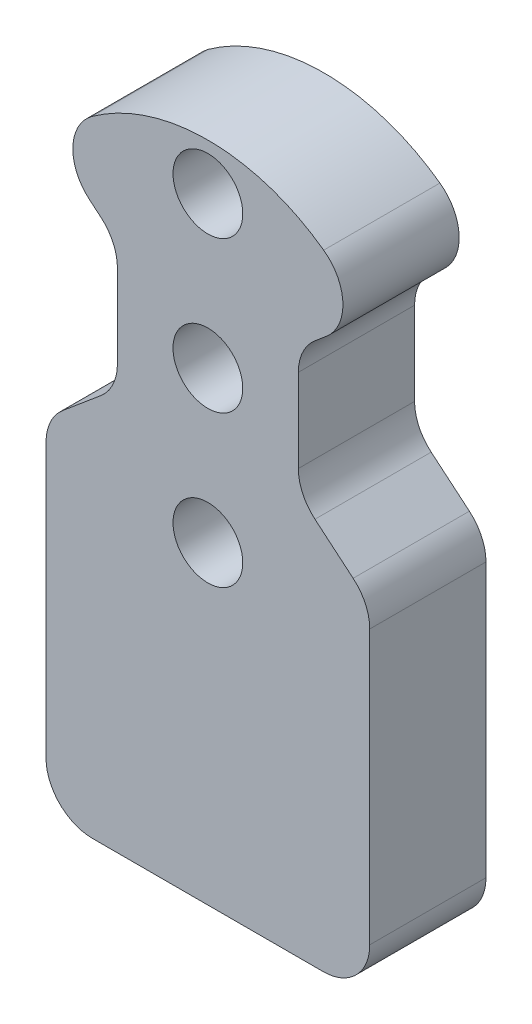
ISO-10303-21;
HEADER;
FILE_DESCRIPTION(('STEP AP214'),'2;1');
FILE_NAME('part.step','',(''),(''),'','','');
FILE_SCHEMA(('AUTOMOTIVE_DESIGN { 1 0 10303 214 1 1 1 1 }'));
ENDSEC;
DATA;
#1=APPLICATION_CONTEXT('core data for automotive mechanical design processes');
#2=APPLICATION_PROTOCOL_DEFINITION('international standard','automotive_design',2000,#1);
#3=PRODUCT_CONTEXT('',#1,'mechanical');
#4=PRODUCT('Part','Part','',(#3));
#5=PRODUCT_RELATED_PRODUCT_CATEGORY('part','',(#4));
#6=PRODUCT_DEFINITION_FORMATION('','',#4);
#7=PRODUCT_DEFINITION_CONTEXT('part definition',#1,'design');
#8=PRODUCT_DEFINITION('design','',#6,#7);
#9=PRODUCT_DEFINITION_SHAPE('','',#8);
#10=(LENGTH_UNIT() NAMED_UNIT(*) SI_UNIT(.MILLI.,.METRE.));
#11=(NAMED_UNIT(*) PLANE_ANGLE_UNIT() SI_UNIT($,.RADIAN.));
#12=(NAMED_UNIT(*) SI_UNIT($,.STERADIAN.) SOLID_ANGLE_UNIT());
#13=UNCERTAINTY_MEASURE_WITH_UNIT(LENGTH_MEASURE(1.E-05),#10,'distance_accuracy_value','');
#14=(GEOMETRIC_REPRESENTATION_CONTEXT(3) GLOBAL_UNCERTAINTY_ASSIGNED_CONTEXT((#13)) GLOBAL_UNIT_ASSIGNED_CONTEXT((#10,
#11,#12)) REPRESENTATION_CONTEXT('',''));
#15=CARTESIAN_POINT('',(0.,0.,0.));
#16=DIRECTION('',(0.,0.,1.));
#17=DIRECTION('',(1.,0.,0.));
#18=AXIS2_PLACEMENT_3D('',#15,#16,#17);
#19=CARTESIAN_POINT('',(0.,0.,5.));
#20=DIRECTION('',(0.,0.,1.));
#21=DIRECTION('',(1.,0.,0.));
#22=AXIS2_PLACEMENT_3D('',#19,#20,#21);
#23=PLANE('',#22);
#24=CARTESIAN_POINT('',(0.,0.,5.));
#25=DIRECTION('',(0.,0.,-1.));
#26=DIRECTION('',(-1.,0.,0.));
#27=AXIS2_PLACEMENT_3D('',#24,#25,#26);
#28=CIRCLE('',#27,1.5);
#29=CARTESIAN_POINT('',(-1.5,0.,5.));
#30=VERTEX_POINT('',#29);
#31=EDGE_CURVE('E266',#30,#30,#28,.T.);
#32=ORIENTED_EDGE('',*,*,#31,.T.);
#33=EDGE_LOOP('',(#32));
#34=FACE_BOUND('',#33,.T.);
#35=CARTESIAN_POINT('',(0.,6.5,5.));
#36=DIRECTION('',(0.,0.,1.));
#37=DIRECTION('',(1.,0.,0.));
#38=AXIS2_PLACEMENT_3D('',#35,#36,#37);
#39=CIRCLE('',#38,1.5);
#40=CARTESIAN_POINT('',(1.5,6.5,5.));
#41=VERTEX_POINT('',#40);
#42=EDGE_CURVE('E291',#41,#41,#39,.T.);
#43=ORIENTED_EDGE('',*,*,#42,.F.);
#44=EDGE_LOOP('',(#43));
#45=FACE_BOUND('',#44,.T.);
#46=CARTESIAN_POINT('',(0.,-6.5,5.));
#47=DIRECTION('',(0.,0.,1.));
#48=DIRECTION('',(1.,0.,0.));
#49=AXIS2_PLACEMENT_3D('',#46,#47,#48);
#50=CIRCLE('',#49,1.5);
#51=CARTESIAN_POINT('',(1.5,-6.5,5.));
#52=VERTEX_POINT('',#51);
#53=EDGE_CURVE('E279',#52,#52,#50,.T.);
#54=ORIENTED_EDGE('',*,*,#53,.F.);
#55=EDGE_LOOP('',(#54));
#56=FACE_BOUND('',#55,.T.);
#57=DIRECTION('',(0.,-1.,0.));
#58=VECTOR('',#57,1.);
#59=CARTESIAN_POINT('',(6.96279237645642,0.,5.));
#60=LINE('',#59,#58);
#61=CARTESIAN_POINT('',(6.96279237645642,-6.23466655738126,5.));
#62=VERTEX_POINT('',#61);
#63=CARTESIAN_POINT('',(6.96279237645642,-18.,5.));
#64=VERTEX_POINT('',#63);
#65=EDGE_CURVE('E273',#62,#64,#60,.T.);
#66=ORIENTED_EDGE('',*,*,#65,.F.);
#67=CARTESIAN_POINT('',(4.96279237645642,-6.23466655738126,5.));
#68=DIRECTION('',(0.,0.,1.));
#69=DIRECTION('',(1.,0.,0.));
#70=AXIS2_PLACEMENT_3D('',#67,#68,#69);
#71=CIRCLE('',#70,2.);
#72=CARTESIAN_POINT('',(6.2483675958295,-4.7025776711433,5.));
#73=VERTEX_POINT('',#72);
#74=EDGE_CURVE('E338',#62,#73,#71,.T.);
#75=ORIENTED_EDGE('',*,*,#74,.T.);
#76=DIRECTION('',(0.766044443118977,-0.642787609686541,0.));
#77=VECTOR('',#76,1.);
#78=CARTESIAN_POINT('',(0.266107499868307,0.317134568984317,5.));
#79=LINE('',#78,#77);
#80=CARTESIAN_POINT('',(4.60539699099962,-3.32396164259543,5.));
#81=VERTEX_POINT('',#80);
#82=EDGE_CURVE('E241',#81,#73,#79,.T.);
#83=ORIENTED_EDGE('',*,*,#82,.F.);
#84=CARTESIAN_POINT('',(5.89097221037271,-1.79187275635748,5.));
#85=DIRECTION('',(0.,0.,1.));
#86=DIRECTION('',(1.,0.,0.));
#87=AXIS2_PLACEMENT_3D('',#84,#85,#86);
#88=CIRCLE('',#87,2.);
#89=CARTESIAN_POINT('',(3.89097221037271,-1.79187275635748,5.));
#90=VERTEX_POINT('',#89);
#91=EDGE_CURVE('E371',#81,#90,#88,.F.);
#92=ORIENTED_EDGE('',*,*,#91,.T.);
#93=DIRECTION('',(0.,-1.,0.));
#94=VECTOR('',#93,1.);
#95=CARTESIAN_POINT('',(3.89097221037271,0.,5.));
#96=LINE('',#95,#94);
#97=CARTESIAN_POINT('',(3.89097221037271,1.79187275635747,5.));
#98=VERTEX_POINT('',#97);
#99=EDGE_CURVE('E254',#98,#90,#96,.T.);
#100=ORIENTED_EDGE('',*,*,#99,.F.);
#101=CARTESIAN_POINT('',(5.89097221037271,1.79187275635747,5.));
#102=DIRECTION('',(0.,0.,1.));
#103=DIRECTION('',(1.,0.,0.));
#104=AXIS2_PLACEMENT_3D('',#101,#102,#103);
#105=CIRCLE('',#104,2.);
#106=CARTESIAN_POINT('',(4.60539699099964,3.32396164259543,5.));
#107=VERTEX_POINT('',#106);
#108=EDGE_CURVE('E218',#98,#107,#105,.F.);
#109=ORIENTED_EDGE('',*,*,#108,.T.);
#110=DIRECTION('',(0.766044443118982,0.642787609686535,0.));
#111=VECTOR('',#110,1.);
#112=CARTESIAN_POINT('',(0.266107499868282,-0.317134568984292,5.));
#113=LINE('',#112,#111);
#114=CARTESIAN_POINT('',(5.09489655719941,3.73470054805509,5.));
#115=VERTEX_POINT('',#114);
#116=EDGE_CURVE('E228',#107,#115,#113,.T.);
#117=ORIENTED_EDGE('',*,*,#116,.T.);
#118=CARTESIAN_POINT('',(3.80932133782634,5.26678943429306,5.));
#119=DIRECTION('',(0.,0.,1.));
#120=DIRECTION('',(1.,0.,0.));
#121=AXIS2_PLACEMENT_3D('',#118,#119,#120);
#122=CIRCLE('',#121,2.);
#123=CARTESIAN_POINT('',(4.98142021100367,6.88734002946015,5.));
#124=VERTEX_POINT('',#123);
#125=EDGE_CURVE('E329',#115,#124,#122,.T.);
#126=ORIENTED_EDGE('',*,*,#125,.T.);
#127=CARTESIAN_POINT('',(0.,0.,5.));
#128=DIRECTION('',(0.,0.,1.));
#129=DIRECTION('',(1.,0.,0.));
#130=AXIS2_PLACEMENT_3D('',#127,#128,#129);
#131=CIRCLE('',#130,8.5);
#132=CARTESIAN_POINT('',(-4.98142021100366,6.88734002946016,5.));
#133=VERTEX_POINT('',#132);
#134=EDGE_CURVE('E299',#124,#133,#131,.T.);
#135=ORIENTED_EDGE('',*,*,#134,.T.);
#136=CARTESIAN_POINT('',(-3.80932133782633,5.26678943429306,5.));
#137=DIRECTION('',(0.,0.,1.));
#138=DIRECTION('',(1.,0.,0.));
#139=AXIS2_PLACEMENT_3D('',#136,#137,#138);
#140=CIRCLE('',#139,2.);
#141=CARTESIAN_POINT('',(-5.09489655719941,3.73470054805511,5.));
#142=VERTEX_POINT('',#141);
#143=EDGE_CURVE('E331',#133,#142,#140,.T.);
#144=ORIENTED_EDGE('',*,*,#143,.T.);
#145=DIRECTION('',(-0.766044443118977,0.642787609686541,0.));
#146=VECTOR('',#145,1.);
#147=CARTESIAN_POINT('',(-0.266107499868308,-0.317134568984318,5.));
#148=LINE('',#147,#146);
#149=CARTESIAN_POINT('',(-4.60539699099963,3.32396164259543,5.));
#150=VERTEX_POINT('',#149);
#151=EDGE_CURVE('E253',#150,#142,#148,.T.);
#152=ORIENTED_EDGE('',*,*,#151,.F.);
#153=CARTESIAN_POINT('',(-5.89097221037271,1.79187275635748,5.));
#154=DIRECTION('',(0.,0.,1.));
#155=DIRECTION('',(1.,0.,0.));
#156=AXIS2_PLACEMENT_3D('',#153,#154,#155);
#157=CIRCLE('',#156,2.);
#158=CARTESIAN_POINT('',(-3.89097221037271,1.79187275635748,5.));
#159=VERTEX_POINT('',#158);
#160=EDGE_CURVE('E12',#150,#159,#157,.F.);
#161=ORIENTED_EDGE('',*,*,#160,.T.);
#162=DIRECTION('',(0.,1.,0.));
#163=VECTOR('',#162,1.);
#164=CARTESIAN_POINT('',(-3.89097221037271,0.,5.));
#165=LINE('',#164,#163);
#166=CARTESIAN_POINT('',(-3.89097221037271,-1.79187275635747,5.));
#167=VERTEX_POINT('',#166);
#168=EDGE_CURVE('E260',#167,#159,#165,.T.);
#169=ORIENTED_EDGE('',*,*,#168,.F.);
#170=CARTESIAN_POINT('',(-5.89097221037271,-1.79187275635747,5.));
#171=DIRECTION('',(0.,0.,1.));
#172=DIRECTION('',(1.,0.,0.));
#173=AXIS2_PLACEMENT_3D('',#170,#171,#172);
#174=CIRCLE('',#173,2.);
#175=CARTESIAN_POINT('',(-4.60539699099964,-3.32396164259544,5.));
#176=VERTEX_POINT('',#175);
#177=EDGE_CURVE('E375',#167,#176,#174,.F.);
#178=ORIENTED_EDGE('',*,*,#177,.T.);
#179=DIRECTION('',(-0.766044443118982,-0.642787609686535,0.));
#180=VECTOR('',#179,1.);
#181=CARTESIAN_POINT('',(-0.266107499868282,0.317134568984292,5.));
#182=LINE('',#181,#180);
#183=CARTESIAN_POINT('',(-6.24836759582949,-4.70257767114326,5.));
#184=VERTEX_POINT('',#183);
#185=EDGE_CURVE('E247',#176,#184,#182,.T.);
#186=ORIENTED_EDGE('',*,*,#185,.T.);
#187=CARTESIAN_POINT('',(-4.96279237645642,-6.23466655738123,5.));
#188=DIRECTION('',(0.,0.,1.));
#189=DIRECTION('',(1.,0.,0.));
#190=AXIS2_PLACEMENT_3D('',#187,#188,#189);
#191=CIRCLE('',#190,2.);
#192=CARTESIAN_POINT('',(-6.96279237645642,-6.23466655738123,5.));
#193=VERTEX_POINT('',#192);
#194=EDGE_CURVE('E333',#184,#193,#191,.T.);
#195=ORIENTED_EDGE('',*,*,#194,.T.);
#196=DIRECTION('',(0.,-1.,0.));
#197=VECTOR('',#196,1.);
#198=CARTESIAN_POINT('',(-6.96279237645642,0.,5.));
#199=LINE('',#198,#197);
#200=CARTESIAN_POINT('',(-6.96279237645642,-18.,5.));
#201=VERTEX_POINT('',#200);
#202=EDGE_CURVE('E271',#193,#201,#199,.T.);
#203=ORIENTED_EDGE('',*,*,#202,.T.);
#204=CARTESIAN_POINT('',(-4.96279237645642,-18.,5.));
#205=DIRECTION('',(0.,0.,1.));
#206=DIRECTION('',(1.,0.,0.));
#207=AXIS2_PLACEMENT_3D('',#204,#205,#206);
#208=CIRCLE('',#207,2.);
#209=CARTESIAN_POINT('',(-4.96279237645642,-20.,5.));
#210=VERTEX_POINT('',#209);
#211=EDGE_CURVE('E85',#201,#210,#208,.T.);
#212=ORIENTED_EDGE('',*,*,#211,.T.);
#213=DIRECTION('',(-1.,0.,0.));
#214=VECTOR('',#213,1.);
#215=CARTESIAN_POINT('',(0.,-20.,5.));
#216=LINE('',#215,#214);
#217=CARTESIAN_POINT('',(4.96279237645642,-20.,5.));
#218=VERTEX_POINT('',#217);
#219=EDGE_CURVE('E277',#218,#210,#216,.T.);
#220=ORIENTED_EDGE('',*,*,#219,.F.);
#221=CARTESIAN_POINT('',(4.96279237645642,-18.,5.));
#222=DIRECTION('',(0.,0.,1.));
#223=DIRECTION('',(1.,0.,0.));
#224=AXIS2_PLACEMENT_3D('',#221,#222,#223);
#225=CIRCLE('',#224,2.);
#226=EDGE_CURVE('E336',#218,#64,#225,.T.);
#227=ORIENTED_EDGE('',*,*,#226,.T.);
#228=EDGE_LOOP('',(#66,#75,#83,#92,#100,#109,#117,#126,#135,#144,#152,#161,#169,#178,#186,#195,
#203,#212,#220,#227));
#229=FACE_BOUND('',#228,.T.);
#230=ADVANCED_FACE('F70',(#34,#45,#56,#229),#23,.T.);
#231=CARTESIAN_POINT('',(0.,0.,0.));
#232=DIRECTION('',(0.,0.,1.));
#233=DIRECTION('',(1.,0.,0.));
#234=AXIS2_PLACEMENT_3D('',#231,#232,#233);
#235=PLANE('',#234);
#236=CARTESIAN_POINT('',(0.,0.,0.));
#237=DIRECTION('',(0.,0.,-1.));
#238=DIRECTION('',(-1.,0.,0.));
#239=AXIS2_PLACEMENT_3D('',#236,#237,#238);
#240=CIRCLE('',#239,1.5);
#241=CARTESIAN_POINT('',(-1.5,0.,0.));
#242=VERTEX_POINT('',#241);
#243=EDGE_CURVE('E244',#242,#242,#240,.T.);
#244=ORIENTED_EDGE('',*,*,#243,.F.);
#245=EDGE_LOOP('',(#244));
#246=FACE_BOUND('',#245,.T.);
#247=CARTESIAN_POINT('',(0.,6.5,0.));
#248=DIRECTION('',(0.,0.,1.));
#249=DIRECTION('',(1.,0.,0.));
#250=AXIS2_PLACEMENT_3D('',#247,#248,#249);
#251=CIRCLE('',#250,1.5);
#252=CARTESIAN_POINT('',(1.5,6.5,0.));
#253=VERTEX_POINT('',#252);
#254=EDGE_CURVE('E287',#253,#253,#251,.T.);
#255=ORIENTED_EDGE('',*,*,#254,.T.);
#256=EDGE_LOOP('',(#255));
#257=FACE_BOUND('',#256,.T.);
#258=CARTESIAN_POINT('',(0.,-6.5,0.));
#259=DIRECTION('',(0.,0.,1.));
#260=DIRECTION('',(1.,0.,0.));
#261=AXIS2_PLACEMENT_3D('',#258,#259,#260);
#262=CIRCLE('',#261,1.5);
#263=CARTESIAN_POINT('',(1.5,-6.5,0.));
#264=VERTEX_POINT('',#263);
#265=EDGE_CURVE('E294',#264,#264,#262,.T.);
#266=ORIENTED_EDGE('',*,*,#265,.T.);
#267=EDGE_LOOP('',(#266));
#268=FACE_BOUND('',#267,.T.);
#269=DIRECTION('',(0.766044443118977,-0.642787609686541,0.));
#270=VECTOR('',#269,1.);
#271=CARTESIAN_POINT('',(0.266107499868307,0.317134568984317,0.));
#272=LINE('',#271,#270);
#273=CARTESIAN_POINT('',(4.60539699099962,-3.32396164259543,0.));
#274=VERTEX_POINT('',#273);
#275=CARTESIAN_POINT('',(6.2483675958295,-4.7025776711433,0.));
#276=VERTEX_POINT('',#275);
#277=EDGE_CURVE('E245',#274,#276,#272,.T.);
#278=ORIENTED_EDGE('',*,*,#277,.T.);
#279=CARTESIAN_POINT('',(4.96279237645642,-6.23466655738126,0.));
#280=DIRECTION('',(0.,0.,1.));
#281=DIRECTION('',(1.,0.,0.));
#282=AXIS2_PLACEMENT_3D('',#279,#280,#281);
#283=CIRCLE('',#282,2.);
#284=CARTESIAN_POINT('',(6.96279237645642,-6.23466655738126,0.));
#285=VERTEX_POINT('',#284);
#286=EDGE_CURVE('E322',#276,#285,#283,.F.);
#287=ORIENTED_EDGE('',*,*,#286,.T.);
#288=DIRECTION('',(0.,-1.,0.));
#289=VECTOR('',#288,1.);
#290=CARTESIAN_POINT('',(6.96279237645642,0.,0.));
#291=LINE('',#290,#289);
#292=CARTESIAN_POINT('',(6.96279237645642,-18.,0.));
#293=VERTEX_POINT('',#292);
#294=EDGE_CURVE('E282',#285,#293,#291,.T.);
#295=ORIENTED_EDGE('',*,*,#294,.T.);
#296=CARTESIAN_POINT('',(4.96279237645642,-18.,0.));
#297=DIRECTION('',(0.,0.,1.));
#298=DIRECTION('',(1.,0.,0.));
#299=AXIS2_PLACEMENT_3D('',#296,#297,#298);
#300=CIRCLE('',#299,2.);
#301=CARTESIAN_POINT('',(4.96279237645642,-20.,0.));
#302=VERTEX_POINT('',#301);
#303=EDGE_CURVE('E320',#293,#302,#300,.F.);
#304=ORIENTED_EDGE('',*,*,#303,.T.);
#305=DIRECTION('',(-1.,0.,0.));
#306=VECTOR('',#305,1.);
#307=CARTESIAN_POINT('',(0.,-20.,0.));
#308=LINE('',#307,#306);
#309=CARTESIAN_POINT('',(-4.96279237645642,-20.,0.));
#310=VERTEX_POINT('',#309);
#311=EDGE_CURVE('E274',#302,#310,#308,.T.);
#312=ORIENTED_EDGE('',*,*,#311,.T.);
#313=CARTESIAN_POINT('',(-4.96279237645642,-18.,0.));
#314=DIRECTION('',(0.,0.,1.));
#315=DIRECTION('',(1.,0.,0.));
#316=AXIS2_PLACEMENT_3D('',#313,#314,#315);
#317=CIRCLE('',#316,2.);
#318=CARTESIAN_POINT('',(-6.96279237645642,-18.,0.));
#319=VERTEX_POINT('',#318);
#320=EDGE_CURVE('E318',#310,#319,#317,.F.);
#321=ORIENTED_EDGE('',*,*,#320,.T.);
#322=DIRECTION('',(0.,-1.,0.));
#323=VECTOR('',#322,1.);
#324=CARTESIAN_POINT('',(-6.96279237645642,0.,0.));
#325=LINE('',#324,#323);
#326=CARTESIAN_POINT('',(-6.96279237645642,-6.23466655738123,0.));
#327=VERTEX_POINT('',#326);
#328=EDGE_CURVE('E257',#327,#319,#325,.T.);
#329=ORIENTED_EDGE('',*,*,#328,.F.);
#330=CARTESIAN_POINT('',(-4.96279237645642,-6.23466655738123,0.));
#331=DIRECTION('',(0.,0.,1.));
#332=DIRECTION('',(1.,0.,0.));
#333=AXIS2_PLACEMENT_3D('',#330,#331,#332);
#334=CIRCLE('',#333,2.);
#335=CARTESIAN_POINT('',(-6.24836759582949,-4.70257767114326,0.));
#336=VERTEX_POINT('',#335);
#337=EDGE_CURVE('E316',#327,#336,#334,.F.);
#338=ORIENTED_EDGE('',*,*,#337,.T.);
#339=DIRECTION('',(-0.766044443118982,-0.642787609686535,0.));
#340=VECTOR('',#339,1.);
#341=CARTESIAN_POINT('',(-0.266107499868282,0.317134568984292,0.));
#342=LINE('',#341,#340);
#343=CARTESIAN_POINT('',(-4.60539699099964,-3.32396164259544,0.));
#344=VERTEX_POINT('',#343);
#345=EDGE_CURVE('E250',#344,#336,#342,.T.);
#346=ORIENTED_EDGE('',*,*,#345,.F.);
#347=CARTESIAN_POINT('',(-5.89097221037271,-1.79187275635747,0.));
#348=DIRECTION('',(0.,0.,1.));
#349=DIRECTION('',(1.,0.,0.));
#350=AXIS2_PLACEMENT_3D('',#347,#348,#349);
#351=CIRCLE('',#350,2.);
#352=CARTESIAN_POINT('',(-3.89097221037271,-1.79187275635747,0.));
#353=VERTEX_POINT('',#352);
#354=EDGE_CURVE('E373',#344,#353,#351,.T.);
#355=ORIENTED_EDGE('',*,*,#354,.T.);
#356=DIRECTION('',(0.,1.,0.));
#357=VECTOR('',#356,1.);
#358=CARTESIAN_POINT('',(-3.89097221037271,0.,0.));
#359=LINE('',#358,#357);
#360=CARTESIAN_POINT('',(-3.89097221037271,1.79187275635748,0.));
#361=VERTEX_POINT('',#360);
#362=EDGE_CURVE('E263',#353,#361,#359,.T.);
#363=ORIENTED_EDGE('',*,*,#362,.T.);
#364=CARTESIAN_POINT('',(-5.89097221037271,1.79187275635748,0.));
#365=DIRECTION('',(0.,0.,1.));
#366=DIRECTION('',(1.,0.,0.));
#367=AXIS2_PLACEMENT_3D('',#364,#365,#366);
#368=CIRCLE('',#367,2.);
#369=CARTESIAN_POINT('',(-4.60539699099963,3.32396164259543,0.));
#370=VERTEX_POINT('',#369);
#371=EDGE_CURVE('E78',#361,#370,#368,.T.);
#372=ORIENTED_EDGE('',*,*,#371,.T.);
#373=DIRECTION('',(-0.766044443118977,0.642787609686541,0.));
#374=VECTOR('',#373,1.);
#375=CARTESIAN_POINT('',(-0.266107499868308,-0.317134568984318,0.));
#376=LINE('',#375,#374);
#377=CARTESIAN_POINT('',(-5.09489655719941,3.73470054805511,0.));
#378=VERTEX_POINT('',#377);
#379=EDGE_CURVE('E237',#370,#378,#376,.T.);
#380=ORIENTED_EDGE('',*,*,#379,.T.);
#381=CARTESIAN_POINT('',(-3.80932133782633,5.26678943429306,0.));
#382=DIRECTION('',(0.,0.,1.));
#383=DIRECTION('',(1.,0.,0.));
#384=AXIS2_PLACEMENT_3D('',#381,#382,#383);
#385=CIRCLE('',#384,2.);
#386=CARTESIAN_POINT('',(-4.98142021100366,6.88734002946016,0.));
#387=VERTEX_POINT('',#386);
#388=EDGE_CURVE('E314',#378,#387,#385,.F.);
#389=ORIENTED_EDGE('',*,*,#388,.T.);
#390=CARTESIAN_POINT('',(0.,0.,0.));
#391=DIRECTION('',(0.,0.,1.));
#392=DIRECTION('',(1.,0.,0.));
#393=AXIS2_PLACEMENT_3D('',#390,#391,#392);
#394=CIRCLE('',#393,8.5);
#395=CARTESIAN_POINT('',(4.98142021100367,6.88734002946015,0.));
#396=VERTEX_POINT('',#395);
#397=EDGE_CURVE('E290',#396,#387,#394,.T.);
#398=ORIENTED_EDGE('',*,*,#397,.F.);
#399=CARTESIAN_POINT('',(3.80932133782634,5.26678943429306,0.));
#400=DIRECTION('',(0.,0.,1.));
#401=DIRECTION('',(1.,0.,0.));
#402=AXIS2_PLACEMENT_3D('',#399,#400,#401);
#403=CIRCLE('',#402,2.);
#404=CARTESIAN_POINT('',(5.09489655719941,3.73470054805509,0.));
#405=VERTEX_POINT('',#404);
#406=EDGE_CURVE('E235',#396,#405,#403,.F.);
#407=ORIENTED_EDGE('',*,*,#406,.T.);
#408=DIRECTION('',(0.766044443118982,0.642787609686535,0.));
#409=VECTOR('',#408,1.);
#410=CARTESIAN_POINT('',(0.266107499868282,-0.317134568984292,0.));
#411=LINE('',#410,#409);
#412=CARTESIAN_POINT('',(4.60539699099964,3.32396164259543,0.));
#413=VERTEX_POINT('',#412);
#414=EDGE_CURVE('E225',#413,#405,#411,.T.);
#415=ORIENTED_EDGE('',*,*,#414,.F.);
#416=CARTESIAN_POINT('',(5.89097221037271,1.79187275635747,0.));
#417=DIRECTION('',(0.,0.,1.));
#418=DIRECTION('',(1.,0.,0.));
#419=AXIS2_PLACEMENT_3D('',#416,#417,#418);
#420=CIRCLE('',#419,2.);
#421=CARTESIAN_POINT('',(3.89097221037271,1.79187275635747,0.));
#422=VERTEX_POINT('',#421);
#423=EDGE_CURVE('E208',#413,#422,#420,.T.);
#424=ORIENTED_EDGE('',*,*,#423,.T.);
#425=DIRECTION('',(0.,-1.,0.));
#426=VECTOR('',#425,1.);
#427=CARTESIAN_POINT('',(3.89097221037271,0.,0.));
#428=LINE('',#427,#426);
#429=CARTESIAN_POINT('',(3.89097221037271,-1.79187275635748,0.));
#430=VERTEX_POINT('',#429);
#431=EDGE_CURVE('E258',#422,#430,#428,.T.);
#432=ORIENTED_EDGE('',*,*,#431,.T.);
#433=CARTESIAN_POINT('',(5.89097221037271,-1.79187275635748,0.));
#434=DIRECTION('',(0.,0.,1.));
#435=DIRECTION('',(1.,0.,0.));
#436=AXIS2_PLACEMENT_3D('',#433,#434,#435);
#437=CIRCLE('',#436,2.);
#438=EDGE_CURVE('E369',#430,#274,#437,.T.);
#439=ORIENTED_EDGE('',*,*,#438,.T.);
#440=EDGE_LOOP('',(#278,#287,#295,#304,#312,#321,#329,#338,#346,#355,#363,#372,#380,#389,#398,
#407,#415,#424,#432,#439));
#441=FACE_BOUND('',#440,.T.);
#442=ADVANCED_FACE('F233',(#246,#257,#268,#441),#235,.F.);
#443=CARTESIAN_POINT('',(0.,0.,5.));
#444=DIRECTION('',(0.,0.,-1.));
#445=DIRECTION('',(-1.,0.,0.));
#446=AXIS2_PLACEMENT_3D('',#443,#444,#445);
#447=CYLINDRICAL_SURFACE('',#446,8.5);
#448=ORIENTED_EDGE('',*,*,#397,.T.);
#449=DIRECTION('',(0.,0.,-1.));
#450=VECTOR('',#449,1.);
#451=CARTESIAN_POINT('',(-4.98142021100366,6.88734002946016,5.));
#452=LINE('',#451,#450);
#453=EDGE_CURVE('E219',#387,#133,#452,.F.);
#454=ORIENTED_EDGE('',*,*,#453,.T.);
#455=ORIENTED_EDGE('',*,*,#134,.F.);
#456=DIRECTION('',(0.,0.,-1.));
#457=VECTOR('',#456,1.);
#458=CARTESIAN_POINT('',(4.98142021100367,6.88734002946015,5.));
#459=LINE('',#458,#457);
#460=EDGE_CURVE('E364',#124,#396,#459,.T.);
#461=ORIENTED_EDGE('',*,*,#460,.T.);
#462=EDGE_LOOP('',(#448,#454,#455,#461));
#463=FACE_BOUND('',#462,.T.);
#464=ADVANCED_FACE('F445',(#463),#447,.T.);
#465=CARTESIAN_POINT('',(6.96279237645642,0.,5.));
#466=DIRECTION('',(1.,0.,0.));
#467=DIRECTION('',(0.,0.,-1.));
#468=AXIS2_PLACEMENT_3D('',#465,#466,#467);
#469=PLANE('',#468);
#470=ORIENTED_EDGE('',*,*,#294,.F.);
#471=DIRECTION('',(0.,0.,-1.));
#472=VECTOR('',#471,1.);
#473=CARTESIAN_POINT('',(6.96279237645642,-6.23466655738126,5.));
#474=LINE('',#473,#472);
#475=EDGE_CURVE('E327',#285,#62,#474,.F.);
#476=ORIENTED_EDGE('',*,*,#475,.T.);
#477=ORIENTED_EDGE('',*,*,#65,.T.);
#478=DIRECTION('',(0.,0.,-1.));
#479=VECTOR('',#478,1.);
#480=CARTESIAN_POINT('',(6.96279237645642,-18.,5.));
#481=LINE('',#480,#479);
#482=EDGE_CURVE('E324',#64,#293,#481,.T.);
#483=ORIENTED_EDGE('',*,*,#482,.T.);
#484=EDGE_LOOP('',(#470,#476,#477,#483));
#485=FACE_BOUND('',#484,.T.);
#486=ADVANCED_FACE('F422',(#485),#469,.T.);
#487=CARTESIAN_POINT('',(0.,-6.5,0.));
#488=DIRECTION('',(0.,0.,1.));
#489=DIRECTION('',(1.,0.,0.));
#490=AXIS2_PLACEMENT_3D('',#487,#488,#489);
#491=CYLINDRICAL_SURFACE('',#490,1.5);
#492=ORIENTED_EDGE('',*,*,#265,.F.);
#493=EDGE_LOOP('',(#492));
#494=FACE_BOUND('',#493,.T.);
#495=ORIENTED_EDGE('',*,*,#53,.T.);
#496=EDGE_LOOP('',(#495));
#497=FACE_BOUND('',#496,.T.);
#498=ADVANCED_FACE('F468',(#494,#497),#491,.F.);
#499=CARTESIAN_POINT('',(0.,6.5,0.));
#500=DIRECTION('',(0.,0.,1.));
#501=DIRECTION('',(1.,0.,0.));
#502=AXIS2_PLACEMENT_3D('',#499,#500,#501);
#503=CYLINDRICAL_SURFACE('',#502,1.5);
#504=ORIENTED_EDGE('',*,*,#254,.F.);
#505=EDGE_LOOP('',(#504));
#506=FACE_BOUND('',#505,.T.);
#507=ORIENTED_EDGE('',*,*,#42,.T.);
#508=EDGE_LOOP('',(#507));
#509=FACE_BOUND('',#508,.T.);
#510=ADVANCED_FACE('F627',(#506,#509),#503,.F.);
#511=CARTESIAN_POINT('',(-6.96279237645642,0.,5.));
#512=DIRECTION('',(1.,0.,0.));
#513=DIRECTION('',(0.,0.,-1.));
#514=AXIS2_PLACEMENT_3D('',#511,#512,#513);
#515=PLANE('',#514);
#516=ORIENTED_EDGE('',*,*,#328,.T.);
#517=DIRECTION('',(0.,0.,-1.));
#518=VECTOR('',#517,1.);
#519=CARTESIAN_POINT('',(-6.96279237645642,-18.,5.));
#520=LINE('',#519,#518);
#521=EDGE_CURVE('E347',#319,#201,#520,.F.);
#522=ORIENTED_EDGE('',*,*,#521,.T.);
#523=ORIENTED_EDGE('',*,*,#202,.F.);
#524=DIRECTION('',(0.,0.,-1.));
#525=VECTOR('',#524,1.);
#526=CARTESIAN_POINT('',(-6.96279237645642,-6.23466655738123,5.));
#527=LINE('',#526,#525);
#528=EDGE_CURVE('E344',#193,#327,#527,.T.);
#529=ORIENTED_EDGE('',*,*,#528,.T.);
#530=EDGE_LOOP('',(#516,#522,#523,#529));
#531=FACE_BOUND('',#530,.T.);
#532=ADVANCED_FACE('F409',(#531),#515,.F.);
#533=CARTESIAN_POINT('',(0.,-20.,5.));
#534=DIRECTION('',(0.,-1.,0.));
#535=DIRECTION('',(0.,0.,-1.));
#536=AXIS2_PLACEMENT_3D('',#533,#534,#535);
#537=PLANE('',#536);
#538=ORIENTED_EDGE('',*,*,#311,.F.);
#539=DIRECTION('',(0.,0.,-1.));
#540=VECTOR('',#539,1.);
#541=CARTESIAN_POINT('',(4.96279237645642,-20.,5.));
#542=LINE('',#541,#540);
#543=EDGE_CURVE('E92',#302,#218,#542,.F.);
#544=ORIENTED_EDGE('',*,*,#543,.T.);
#545=ORIENTED_EDGE('',*,*,#219,.T.);
#546=DIRECTION('',(0.,0.,-1.));
#547=VECTOR('',#546,1.);
#548=CARTESIAN_POINT('',(-4.96279237645642,-20.,0.));
#549=LINE('',#548,#547);
#550=EDGE_CURVE('E340',#210,#310,#549,.T.);
#551=ORIENTED_EDGE('',*,*,#550,.T.);
#552=EDGE_LOOP('',(#538,#544,#545,#551));
#553=FACE_BOUND('',#552,.T.);
#554=ADVANCED_FACE('F415',(#553),#537,.T.);
#555=CARTESIAN_POINT('',(3.89097221037271,0.,5.));
#556=DIRECTION('',(1.,0.,0.));
#557=DIRECTION('',(0.,0.,-1.));
#558=AXIS2_PLACEMENT_3D('',#555,#556,#557);
#559=PLANE('',#558);
#560=ORIENTED_EDGE('',*,*,#431,.F.);
#561=DIRECTION('',(0.,0.,-1.));
#562=VECTOR('',#561,1.);
#563=CARTESIAN_POINT('',(3.89097221037271,1.79187275635747,5.));
#564=LINE('',#563,#562);
#565=EDGE_CURVE('E213',#422,#98,#564,.F.);
#566=ORIENTED_EDGE('',*,*,#565,.T.);
#567=ORIENTED_EDGE('',*,*,#99,.T.);
#568=DIRECTION('',(0.,0.,-1.));
#569=VECTOR('',#568,1.);
#570=CARTESIAN_POINT('',(3.89097221037271,-1.79187275635748,0.));
#571=LINE('',#570,#569);
#572=EDGE_CURVE('E229',#90,#430,#571,.T.);
#573=ORIENTED_EDGE('',*,*,#572,.T.);
#574=EDGE_LOOP('',(#560,#566,#567,#573));
#575=FACE_BOUND('',#574,.T.);
#576=ADVANCED_FACE('F438',(#575),#559,.T.);
#577=CARTESIAN_POINT('',(-3.89097221037271,0.,5.));
#578=DIRECTION('',(-1.,0.,0.));
#579=DIRECTION('',(0.,-1.,0.));
#580=AXIS2_PLACEMENT_3D('',#577,#578,#579);
#581=PLANE('',#580);
#582=ORIENTED_EDGE('',*,*,#362,.F.);
#583=DIRECTION('',(0.,0.,-1.));
#584=VECTOR('',#583,1.);
#585=CARTESIAN_POINT('',(-3.89097221037271,-1.79187275635747,5.));
#586=LINE('',#585,#584);
#587=EDGE_CURVE('E357',#353,#167,#586,.F.);
#588=ORIENTED_EDGE('',*,*,#587,.T.);
#589=ORIENTED_EDGE('',*,*,#168,.T.);
#590=DIRECTION('',(0.,0.,-1.));
#591=VECTOR('',#590,1.);
#592=CARTESIAN_POINT('',(-3.89097221037271,1.79187275635748,0.));
#593=LINE('',#592,#591);
#594=EDGE_CURVE('E354',#159,#361,#593,.T.);
#595=ORIENTED_EDGE('',*,*,#594,.T.);
#596=EDGE_LOOP('',(#582,#588,#589,#595));
#597=FACE_BOUND('',#596,.T.);
#598=ADVANCED_FACE('F393',(#597),#581,.T.);
#599=CARTESIAN_POINT('',(0.,0.,5.));
#600=DIRECTION('',(0.,0.,-1.));
#601=DIRECTION('',(-1.,0.,0.));
#602=AXIS2_PLACEMENT_3D('',#599,#600,#601);
#603=CYLINDRICAL_SURFACE('',#602,1.5);
#604=ORIENTED_EDGE('',*,*,#31,.F.);
#605=EDGE_LOOP('',(#604));
#606=FACE_BOUND('',#605,.T.);
#607=ORIENTED_EDGE('',*,*,#243,.T.);
#608=EDGE_LOOP('',(#607));
#609=FACE_BOUND('',#608,.T.);
#610=ADVANCED_FACE('F566',(#606,#609),#603,.F.);
#611=CARTESIAN_POINT('',(-0.266107499868282,0.317134568984292,5.));
#612=DIRECTION('',(0.642787609686535,-0.766044443118982,0.));
#613=DIRECTION('',(0.766044443118982,0.642787609686535,0.));
#614=AXIS2_PLACEMENT_3D('',#611,#612,#613);
#615=PLANE('',#614);
#616=ORIENTED_EDGE('',*,*,#345,.T.);
#617=DIRECTION('',(0.,0.,-1.));
#618=VECTOR('',#617,1.);
#619=CARTESIAN_POINT('',(-6.24836759582949,-4.70257767114326,5.));
#620=LINE('',#619,#618);
#621=EDGE_CURVE('E352',#336,#184,#620,.F.);
#622=ORIENTED_EDGE('',*,*,#621,.T.);
#623=ORIENTED_EDGE('',*,*,#185,.F.);
#624=DIRECTION('',(0.,0.,-1.));
#625=VECTOR('',#624,1.);
#626=CARTESIAN_POINT('',(-4.60539699099964,-3.32396164259544,5.));
#627=LINE('',#626,#625);
#628=EDGE_CURVE('E349',#176,#344,#627,.T.);
#629=ORIENTED_EDGE('',*,*,#628,.T.);
#630=EDGE_LOOP('',(#616,#622,#623,#629));
#631=FACE_BOUND('',#630,.T.);
#632=ADVANCED_FACE('F401',(#631),#615,.F.);
#633=CARTESIAN_POINT('',(0.266107499868307,0.317134568984317,5.));
#634=DIRECTION('',(0.642787609686541,0.766044443118977,0.));
#635=DIRECTION('',(-0.766044443118977,0.642787609686541,0.));
#636=AXIS2_PLACEMENT_3D('',#633,#634,#635);
#637=PLANE('',#636);
#638=ORIENTED_EDGE('',*,*,#277,.F.);
#639=DIRECTION('',(0.,0.,-1.));
#640=VECTOR('',#639,1.);
#641=CARTESIAN_POINT('',(4.60539699099963,-3.32396164259543,5.));
#642=LINE('',#641,#640);
#643=EDGE_CURVE('E311',#274,#81,#642,.F.);
#644=ORIENTED_EDGE('',*,*,#643,.T.);
#645=ORIENTED_EDGE('',*,*,#82,.T.);
#646=DIRECTION('',(0.,0.,-1.));
#647=VECTOR('',#646,1.);
#648=CARTESIAN_POINT('',(6.2483675958295,-4.7025776711433,5.));
#649=LINE('',#648,#647);
#650=EDGE_CURVE('E308',#73,#276,#649,.T.);
#651=ORIENTED_EDGE('',*,*,#650,.T.);
#652=EDGE_LOOP('',(#638,#644,#645,#651));
#653=FACE_BOUND('',#652,.T.);
#654=ADVANCED_FACE('F431',(#653),#637,.T.);
#655=CARTESIAN_POINT('',(-0.266107499868308,-0.317134568984318,5.));
#656=DIRECTION('',(-0.642787609686541,-0.766044443118977,0.));
#657=DIRECTION('',(0.766044443118977,-0.642787609686541,0.));
#658=AXIS2_PLACEMENT_3D('',#655,#656,#657);
#659=PLANE('',#658);
#660=ORIENTED_EDGE('',*,*,#379,.F.);
#661=DIRECTION('',(0.,0.,-1.));
#662=VECTOR('',#661,1.);
#663=CARTESIAN_POINT('',(-4.60539699099963,3.32396164259543,5.));
#664=LINE('',#663,#662);
#665=EDGE_CURVE('E362',#370,#150,#664,.F.);
#666=ORIENTED_EDGE('',*,*,#665,.T.);
#667=ORIENTED_EDGE('',*,*,#151,.T.);
#668=DIRECTION('',(0.,0.,1.));
#669=VECTOR('',#668,1.);
#670=CARTESIAN_POINT('',(-5.09489655719941,3.73470054805511,0.));
#671=LINE('',#670,#669);
#672=EDGE_CURVE('E359',#142,#378,#671,.F.);
#673=ORIENTED_EDGE('',*,*,#672,.T.);
#674=EDGE_LOOP('',(#660,#666,#667,#673));
#675=FACE_BOUND('',#674,.T.);
#676=ADVANCED_FACE('F383',(#675),#659,.T.);
#677=CARTESIAN_POINT('',(0.266107499868282,-0.317134568984292,5.));
#678=DIRECTION('',(-0.642787609686535,0.766044443118982,0.));
#679=DIRECTION('',(-0.766044443118982,-0.642787609686535,0.));
#680=AXIS2_PLACEMENT_3D('',#677,#678,#679);
#681=PLANE('',#680);
#682=ORIENTED_EDGE('',*,*,#116,.F.);
#683=DIRECTION('',(0.,0.,-1.));
#684=VECTOR('',#683,1.);
#685=CARTESIAN_POINT('',(4.60539699099964,3.32396164259543,5.));
#686=LINE('',#685,#684);
#687=EDGE_CURVE('E212',#107,#413,#686,.T.);
#688=ORIENTED_EDGE('',*,*,#687,.T.);
#689=ORIENTED_EDGE('',*,*,#414,.T.);
#690=DIRECTION('',(0.,0.,-1.));
#691=VECTOR('',#690,1.);
#692=CARTESIAN_POINT('',(5.09489655719941,3.73470054805509,5.));
#693=LINE('',#692,#691);
#694=EDGE_CURVE('E230',#405,#115,#693,.F.);
#695=ORIENTED_EDGE('',*,*,#694,.T.);
#696=EDGE_LOOP('',(#682,#688,#689,#695));
#697=FACE_BOUND('',#696,.T.);
#698=ADVANCED_FACE('F224',(#697),#681,.F.);
#699=CARTESIAN_POINT('',(5.89097221037271,1.79187275635747,5.));
#700=DIRECTION('',(0.,0.,-1.));
#701=DIRECTION('',(-1.,0.,0.));
#702=AXIS2_PLACEMENT_3D('',#699,#700,#701);
#703=CYLINDRICAL_SURFACE('',#702,2.);
#704=ORIENTED_EDGE('',*,*,#108,.F.);
#705=ORIENTED_EDGE('',*,*,#565,.F.);
#706=ORIENTED_EDGE('',*,*,#423,.F.);
#707=ORIENTED_EDGE('',*,*,#687,.F.);
#708=EDGE_LOOP('',(#704,#705,#706,#707));
#709=FACE_BOUND('',#708,.T.);
#710=ADVANCED_FACE('F211',(#709),#703,.F.);
#711=CARTESIAN_POINT('',(5.89097221037271,-1.79187275635748,5.));
#712=DIRECTION('',(0.,0.,1.));
#713=DIRECTION('',(1.,0.,0.));
#714=AXIS2_PLACEMENT_3D('',#711,#712,#713);
#715=CYLINDRICAL_SURFACE('',#714,2.);
#716=ORIENTED_EDGE('',*,*,#91,.F.);
#717=ORIENTED_EDGE('',*,*,#643,.F.);
#718=ORIENTED_EDGE('',*,*,#438,.F.);
#719=ORIENTED_EDGE('',*,*,#572,.F.);
#720=EDGE_LOOP('',(#716,#717,#718,#719));
#721=FACE_BOUND('',#720,.T.);
#722=ADVANCED_FACE('F436',(#721),#715,.F.);
#723=CARTESIAN_POINT('',(4.96279237645642,-6.23466655738126,5.));
#724=DIRECTION('',(0.,0.,-1.));
#725=DIRECTION('',(-1.,0.,0.));
#726=AXIS2_PLACEMENT_3D('',#723,#724,#725);
#727=CYLINDRICAL_SURFACE('',#726,2.);
#728=ORIENTED_EDGE('',*,*,#74,.F.);
#729=ORIENTED_EDGE('',*,*,#475,.F.);
#730=ORIENTED_EDGE('',*,*,#286,.F.);
#731=ORIENTED_EDGE('',*,*,#650,.F.);
#732=EDGE_LOOP('',(#728,#729,#730,#731));
#733=FACE_BOUND('',#732,.T.);
#734=ADVANCED_FACE('F428',(#733),#727,.T.);
#735=CARTESIAN_POINT('',(4.96279237645642,-18.,5.));
#736=DIRECTION('',(0.,0.,-1.));
#737=DIRECTION('',(-1.,0.,0.));
#738=AXIS2_PLACEMENT_3D('',#735,#736,#737);
#739=CYLINDRICAL_SURFACE('',#738,2.);
#740=ORIENTED_EDGE('',*,*,#226,.F.);
#741=ORIENTED_EDGE('',*,*,#543,.F.);
#742=ORIENTED_EDGE('',*,*,#303,.F.);
#743=ORIENTED_EDGE('',*,*,#482,.F.);
#744=EDGE_LOOP('',(#740,#741,#742,#743));
#745=FACE_BOUND('',#744,.T.);
#746=ADVANCED_FACE('F420',(#745),#739,.T.);
#747=CARTESIAN_POINT('',(-4.96279237645642,-18.,5.));
#748=DIRECTION('',(0.,0.,1.));
#749=DIRECTION('',(1.,0.,0.));
#750=AXIS2_PLACEMENT_3D('',#747,#748,#749);
#751=CYLINDRICAL_SURFACE('',#750,2.);
#752=ORIENTED_EDGE('',*,*,#211,.F.);
#753=ORIENTED_EDGE('',*,*,#521,.F.);
#754=ORIENTED_EDGE('',*,*,#320,.F.);
#755=ORIENTED_EDGE('',*,*,#550,.F.);
#756=EDGE_LOOP('',(#752,#753,#754,#755));
#757=FACE_BOUND('',#756,.T.);
#758=ADVANCED_FACE('F413',(#757),#751,.T.);
#759=CARTESIAN_POINT('',(-4.96279237645642,-6.23466655738123,5.));
#760=DIRECTION('',(0.,0.,-1.));
#761=DIRECTION('',(-1.,0.,0.));
#762=AXIS2_PLACEMENT_3D('',#759,#760,#761);
#763=CYLINDRICAL_SURFACE('',#762,2.);
#764=ORIENTED_EDGE('',*,*,#194,.F.);
#765=ORIENTED_EDGE('',*,*,#621,.F.);
#766=ORIENTED_EDGE('',*,*,#337,.F.);
#767=ORIENTED_EDGE('',*,*,#528,.F.);
#768=EDGE_LOOP('',(#764,#765,#766,#767));
#769=FACE_BOUND('',#768,.T.);
#770=ADVANCED_FACE('F405',(#769),#763,.T.);
#771=CARTESIAN_POINT('',(-5.89097221037271,-1.79187275635747,5.));
#772=DIRECTION('',(0.,0.,-1.));
#773=DIRECTION('',(-1.,0.,0.));
#774=AXIS2_PLACEMENT_3D('',#771,#772,#773);
#775=CYLINDRICAL_SURFACE('',#774,2.);
#776=ORIENTED_EDGE('',*,*,#177,.F.);
#777=ORIENTED_EDGE('',*,*,#587,.F.);
#778=ORIENTED_EDGE('',*,*,#354,.F.);
#779=ORIENTED_EDGE('',*,*,#628,.F.);
#780=EDGE_LOOP('',(#776,#777,#778,#779));
#781=FACE_BOUND('',#780,.T.);
#782=ADVANCED_FACE('F396',(#781),#775,.F.);
#783=CARTESIAN_POINT('',(-5.89097221037271,1.79187275635748,5.));
#784=DIRECTION('',(0.,0.,1.));
#785=DIRECTION('',(1.,0.,0.));
#786=AXIS2_PLACEMENT_3D('',#783,#784,#785);
#787=CYLINDRICAL_SURFACE('',#786,2.);
#788=ORIENTED_EDGE('',*,*,#160,.F.);
#789=ORIENTED_EDGE('',*,*,#665,.F.);
#790=ORIENTED_EDGE('',*,*,#371,.F.);
#791=ORIENTED_EDGE('',*,*,#594,.F.);
#792=EDGE_LOOP('',(#788,#789,#790,#791));
#793=FACE_BOUND('',#792,.T.);
#794=ADVANCED_FACE('F388',(#793),#787,.F.);
#795=CARTESIAN_POINT('',(-3.80932133782633,5.26678943429306,5.));
#796=DIRECTION('',(0.,0.,-1.));
#797=DIRECTION('',(-1.,0.,0.));
#798=AXIS2_PLACEMENT_3D('',#795,#796,#797);
#799=CYLINDRICAL_SURFACE('',#798,2.);
#800=ORIENTED_EDGE('',*,*,#143,.F.);
#801=ORIENTED_EDGE('',*,*,#453,.F.);
#802=ORIENTED_EDGE('',*,*,#388,.F.);
#803=ORIENTED_EDGE('',*,*,#672,.F.);
#804=EDGE_LOOP('',(#800,#801,#802,#803));
#805=FACE_BOUND('',#804,.T.);
#806=ADVANCED_FACE('F449',(#805),#799,.T.);
#807=CARTESIAN_POINT('',(3.80932133782634,5.26678943429306,5.));
#808=DIRECTION('',(0.,0.,-1.));
#809=DIRECTION('',(-1.,0.,0.));
#810=AXIS2_PLACEMENT_3D('',#807,#808,#809);
#811=CYLINDRICAL_SURFACE('',#810,2.);
#812=ORIENTED_EDGE('',*,*,#125,.F.);
#813=ORIENTED_EDGE('',*,*,#694,.F.);
#814=ORIENTED_EDGE('',*,*,#406,.F.);
#815=ORIENTED_EDGE('',*,*,#460,.F.);
#816=EDGE_LOOP('',(#812,#813,#814,#815));
#817=FACE_BOUND('',#816,.T.);
#818=ADVANCED_FACE('F72',(#817),#811,.T.);
#819=CLOSED_SHELL('',(#230,#442,#464,#486,#498,#510,#532,#554,#576,#598,#610,#632,#654,#676,
#698,#710,#722,#734,#746,#758,#770,#782,#794,#806,#818));
#820=MANIFOLD_SOLID_BREP('B2',#819);
#821=ADVANCED_BREP_SHAPE_REPRESENTATION('',(#18,#820),#14);
#822=SHAPE_DEFINITION_REPRESENTATION(#9,#821);
ENDSEC;
END-ISO-10303-21;
